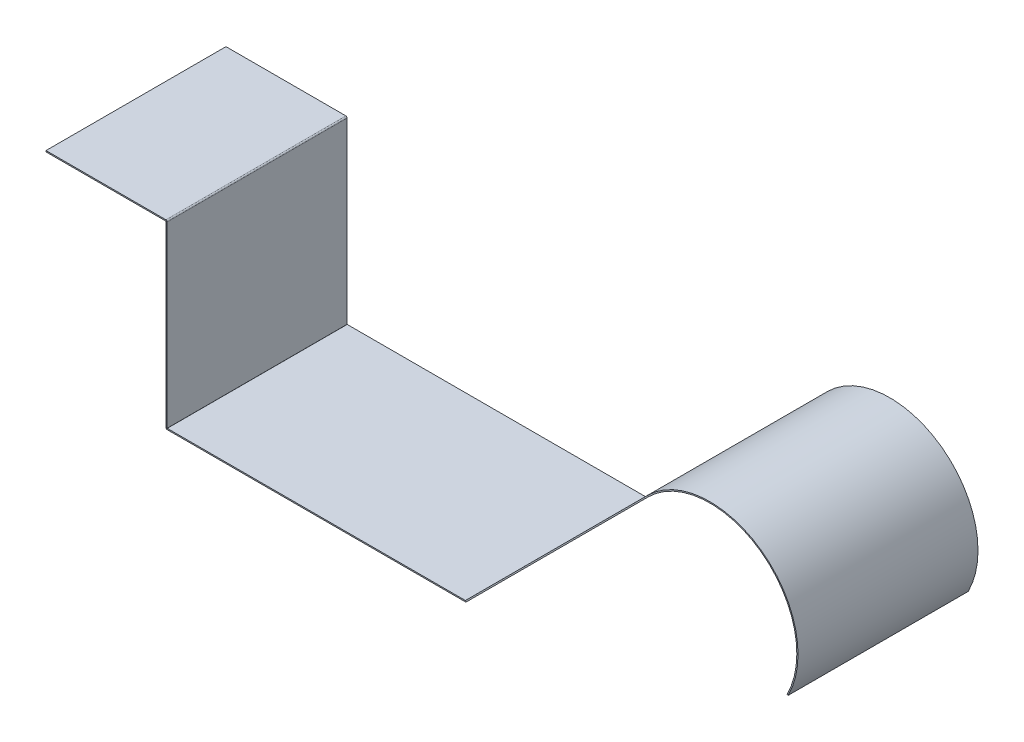
ISO-10303-21;
HEADER;
FILE_DESCRIPTION(('STEP AP214'),'2;1');
FILE_NAME('part.step','',(''),(''),'','','');
FILE_SCHEMA(('AUTOMOTIVE_DESIGN { 1 0 10303 214 1 1 1 1 }'));
ENDSEC;
DATA;
#1=APPLICATION_CONTEXT('core data for automotive mechanical design processes');
#2=APPLICATION_PROTOCOL_DEFINITION('international standard','automotive_design',2000,#1);
#3=PRODUCT_CONTEXT('',#1,'mechanical');
#4=PRODUCT('Part','Part','',(#3));
#5=PRODUCT_RELATED_PRODUCT_CATEGORY('part','',(#4));
#6=PRODUCT_DEFINITION_FORMATION('','',#4);
#7=PRODUCT_DEFINITION_CONTEXT('part definition',#1,'design');
#8=PRODUCT_DEFINITION('design','',#6,#7);
#9=PRODUCT_DEFINITION_SHAPE('','',#8);
#10=(LENGTH_UNIT() NAMED_UNIT(*) SI_UNIT(.MILLI.,.METRE.));
#11=(NAMED_UNIT(*) PLANE_ANGLE_UNIT() SI_UNIT($,.RADIAN.));
#12=(NAMED_UNIT(*) SI_UNIT($,.STERADIAN.) SOLID_ANGLE_UNIT());
#13=UNCERTAINTY_MEASURE_WITH_UNIT(LENGTH_MEASURE(1.E-05),#10,'distance_accuracy_value','');
#14=(GEOMETRIC_REPRESENTATION_CONTEXT(3) GLOBAL_UNCERTAINTY_ASSIGNED_CONTEXT((#13)) GLOBAL_UNIT_ASSIGNED_CONTEXT((#10,
#11,#12)) REPRESENTATION_CONTEXT('',''));
#15=CARTESIAN_POINT('',(0.,0.,0.));
#16=DIRECTION('',(0.,0.,1.));
#17=DIRECTION('',(1.,0.,0.));
#18=AXIS2_PLACEMENT_3D('',#15,#16,#17);
#19=CARTESIAN_POINT('',(802.641702347842,305.470129472589,-300.));
#20=DIRECTION('',(0.,0.,-1.));
#21=DIRECTION('',(-1.,0.,0.));
#22=AXIS2_PLACEMENT_3D('',#19,#20,#21);
#23=PLANE('',#22);
#24=DIRECTION('',(0.707106781186561,-0.707106781186534,0.));
#25=VECTOR('',#24,1.);
#26=CARTESIAN_POINT('',(802.641702347842,305.470129472589,-300.));
#27=LINE('',#26,#25);
#28=CARTESIAN_POINT('',(802.641702347842,305.470129472589,-300.));
#29=VERTEX_POINT('',#28);
#30=CARTESIAN_POINT('',(804.055915910215,304.055915910216,-300.));
#31=VERTEX_POINT('',#30);
#32=EDGE_CURVE('E11',#29,#31,#27,.T.);
#33=ORIENTED_EDGE('',*,*,#32,.F.);
#34=CARTESIAN_POINT('',(906.586399182264,201.525432638167,-300.));
#35=DIRECTION('',(0.,0.,1.));
#36=DIRECTION('',(1.,0.,0.));
#37=AXIS2_PLACEMENT_3D('',#34,#35,#36);
#38=CIRCLE('',#37,147.);
#39=CARTESIAN_POINT('',(1037.18815341574,134.055574248377,-300.));
#40=VERTEX_POINT('',#39);
#41=EDGE_CURVE('E394',#29,#40,#38,.F.);
#42=ORIENTED_EDGE('',*,*,#41,.T.);
#43=DIRECTION('',(-0.888447307710709,0.458978628502016,0.));
#44=VECTOR('',#43,1.);
#45=CARTESIAN_POINT('',(1037.18815341574,134.055574248377,-300.));
#46=LINE('',#45,#44);
#47=CARTESIAN_POINT('',(1035.41125880032,134.973531505381,-300.));
#48=VERTEX_POINT('',#47);
#49=EDGE_CURVE('E130',#40,#48,#46,.T.);
#50=ORIENTED_EDGE('',*,*,#49,.T.);
#51=CARTESIAN_POINT('',(906.586399182264,201.525432638167,-300.));
#52=DIRECTION('',(0.,0.,-1.));
#53=DIRECTION('',(-1.,0.,0.));
#54=AXIS2_PLACEMENT_3D('',#51,#52,#53);
#55=CIRCLE('',#54,145.);
#56=EDGE_CURVE('E292',#31,#48,#55,.T.);
#57=ORIENTED_EDGE('',*,*,#56,.F.);
#58=EDGE_LOOP('',(#33,#42,#50,#57));
#59=FACE_BOUND('',#58,.T.);
#60=ADVANCED_FACE('F41',(#59),#23,.T.);
#61=CARTESIAN_POINT('',(804.055915910215,304.055915910216,0.));
#62=DIRECTION('',(0.,0.,1.));
#63=DIRECTION('',(1.,0.,0.));
#64=AXIS2_PLACEMENT_3D('',#61,#62,#63);
#65=PLANE('',#64);
#66=DIRECTION('',(-0.707106781186561,0.707106781186534,0.));
#67=VECTOR('',#66,1.);
#68=CARTESIAN_POINT('',(804.055915910215,304.055915910216,0.));
#69=LINE('',#68,#67);
#70=CARTESIAN_POINT('',(804.055915910215,304.055915910216,0.));
#71=VERTEX_POINT('',#70);
#72=CARTESIAN_POINT('',(802.641702347842,305.470129472589,0.));
#73=VERTEX_POINT('',#72);
#74=EDGE_CURVE('E50',#71,#73,#69,.T.);
#75=ORIENTED_EDGE('',*,*,#74,.F.);
#76=CARTESIAN_POINT('',(906.586399182264,201.525432638167,0.));
#77=DIRECTION('',(0.,0.,-1.));
#78=DIRECTION('',(-1.,0.,0.));
#79=AXIS2_PLACEMENT_3D('',#76,#77,#78);
#80=CIRCLE('',#79,145.);
#81=CARTESIAN_POINT('',(1035.41125880032,134.973531505381,0.));
#82=VERTEX_POINT('',#81);
#83=EDGE_CURVE('E227',#71,#82,#80,.T.);
#84=ORIENTED_EDGE('',*,*,#83,.T.);
#85=DIRECTION('',(-0.888447307710709,0.458978628502016,0.));
#86=VECTOR('',#85,1.);
#87=CARTESIAN_POINT('',(1037.18815341574,134.055574248377,0.));
#88=LINE('',#87,#86);
#89=CARTESIAN_POINT('',(1037.18815341574,134.055574248377,0.));
#90=VERTEX_POINT('',#89);
#91=EDGE_CURVE('E230',#90,#82,#88,.T.);
#92=ORIENTED_EDGE('',*,*,#91,.F.);
#93=CARTESIAN_POINT('',(906.586399182264,201.525432638167,0.));
#94=DIRECTION('',(0.,0.,1.));
#95=DIRECTION('',(1.,0.,0.));
#96=AXIS2_PLACEMENT_3D('',#93,#94,#95);
#97=CIRCLE('',#96,147.);
#98=EDGE_CURVE('E234',#73,#90,#97,.F.);
#99=ORIENTED_EDGE('',*,*,#98,.F.);
#100=EDGE_LOOP('',(#75,#84,#92,#99));
#101=FACE_BOUND('',#100,.T.);
#102=ADVANCED_FACE('F396',(#101),#65,.T.);
#103=CARTESIAN_POINT('',(0.,299.9,-300.));
#104=DIRECTION('',(0.,0.,-1.));
#105=DIRECTION('',(-1.,0.,0.));
#106=AXIS2_PLACEMENT_3D('',#103,#104,#105);
#107=PLANE('',#106);
#108=DIRECTION('',(1.,0.,0.));
#109=VECTOR('',#108,1.);
#110=CARTESIAN_POINT('',(0.,299.9,-300.));
#111=LINE('',#110,#109);
#112=CARTESIAN_POINT('',(0.,299.9,-300.));
#113=VERTEX_POINT('',#112);
#114=CARTESIAN_POINT('',(2.,299.9,-300.));
#115=VERTEX_POINT('',#114);
#116=EDGE_CURVE('E380',#113,#115,#111,.T.);
#117=ORIENTED_EDGE('',*,*,#116,.F.);
#118=CARTESIAN_POINT('',(-0.0999999999999957,299.9,-300.));
#119=DIRECTION('',(0.,0.,1.));
#120=DIRECTION('',(1.,0.,0.));
#121=AXIS2_PLACEMENT_3D('',#118,#119,#120);
#122=CIRCLE('',#121,0.1);
#123=CARTESIAN_POINT('',(-0.099999999999989,300.,-300.));
#124=VERTEX_POINT('',#123);
#125=EDGE_CURVE('E439',#124,#113,#122,.F.);
#126=ORIENTED_EDGE('',*,*,#125,.F.);
#127=DIRECTION('',(0.,-1.,0.));
#128=VECTOR('',#127,1.);
#129=CARTESIAN_POINT('',(-0.0999999999998539,302.,-300.));
#130=LINE('',#129,#128);
#131=CARTESIAN_POINT('',(-0.0999999999998539,302.,-300.));
#132=VERTEX_POINT('',#131);
#133=EDGE_CURVE('E377',#132,#124,#130,.T.);
#134=ORIENTED_EDGE('',*,*,#133,.F.);
#135=CARTESIAN_POINT('',(-0.0999999999999957,299.9,-300.));
#136=DIRECTION('',(0.,0.,1.));
#137=DIRECTION('',(1.,0.,0.));
#138=AXIS2_PLACEMENT_3D('',#135,#136,#137);
#139=CIRCLE('',#138,2.1);
#140=EDGE_CURVE('E424',#132,#115,#139,.F.);
#141=ORIENTED_EDGE('',*,*,#140,.T.);
#142=EDGE_LOOP('',(#117,#126,#134,#141));
#143=FACE_BOUND('',#142,.T.);
#144=ADVANCED_FACE('F459',(#143),#107,.T.);
#145=CARTESIAN_POINT('',(-0.0999999999998539,302.,-300.));
#146=DIRECTION('',(0.,0.,-1.));
#147=DIRECTION('',(-1.,0.,0.));
#148=AXIS2_PLACEMENT_3D('',#145,#146,#147);
#149=PLANE('',#148);
#150=DIRECTION('',(0.,-1.,0.));
#151=VECTOR('',#150,1.);
#152=CARTESIAN_POINT('',(0.,300.,-300.));
#153=LINE('',#152,#151);
#154=CARTESIAN_POINT('',(0.,2.09999999999999,-300.));
#155=VERTEX_POINT('',#154);
#156=EDGE_CURVE('E219',#113,#155,#153,.T.);
#157=ORIENTED_EDGE('',*,*,#156,.F.);
#158=ORIENTED_EDGE('',*,*,#116,.T.);
#159=DIRECTION('',(0.,-1.,0.));
#160=VECTOR('',#159,1.);
#161=CARTESIAN_POINT('',(2.,300.,-300.));
#162=LINE('',#161,#160);
#163=CARTESIAN_POINT('',(2.,2.1,-300.));
#164=VERTEX_POINT('',#163);
#165=EDGE_CURVE('E420',#115,#164,#162,.T.);
#166=ORIENTED_EDGE('',*,*,#165,.T.);
#167=DIRECTION('',(-1.,0.,0.));
#168=VECTOR('',#167,1.);
#169=CARTESIAN_POINT('',(2.,2.1,-300.));
#170=LINE('',#169,#168);
#171=EDGE_CURVE('E365',#164,#155,#170,.T.);
#172=ORIENTED_EDGE('',*,*,#171,.T.);
#173=EDGE_LOOP('',(#157,#158,#166,#172));
#174=FACE_BOUND('',#173,.T.);
#175=ADVANCED_FACE('F452',(#174),#149,.T.);
#176=CARTESIAN_POINT('',(-0.099999999999989,300.,0.));
#177=DIRECTION('',(0.,0.,1.));
#178=DIRECTION('',(1.,0.,0.));
#179=AXIS2_PLACEMENT_3D('',#176,#177,#178);
#180=PLANE('',#179);
#181=DIRECTION('',(0.,1.,0.));
#182=VECTOR('',#181,1.);
#183=CARTESIAN_POINT('',(-0.099999999999989,300.,0.));
#184=LINE('',#183,#182);
#185=CARTESIAN_POINT('',(-0.099999999999989,300.,0.));
#186=VERTEX_POINT('',#185);
#187=CARTESIAN_POINT('',(-0.0999999999998539,302.,0.));
#188=VERTEX_POINT('',#187);
#189=EDGE_CURVE('E374',#186,#188,#184,.T.);
#190=ORIENTED_EDGE('',*,*,#189,.F.);
#191=CARTESIAN_POINT('',(-0.0999999999999957,299.9,0.));
#192=DIRECTION('',(0.,0.,1.));
#193=DIRECTION('',(1.,0.,0.));
#194=AXIS2_PLACEMENT_3D('',#191,#192,#193);
#195=CIRCLE('',#194,0.1);
#196=CARTESIAN_POINT('',(0.,299.9,0.));
#197=VERTEX_POINT('',#196);
#198=EDGE_CURVE('E272',#186,#197,#195,.F.);
#199=ORIENTED_EDGE('',*,*,#198,.T.);
#200=DIRECTION('',(-1.,0.,0.));
#201=VECTOR('',#200,1.);
#202=CARTESIAN_POINT('',(2.,299.9,0.));
#203=LINE('',#202,#201);
#204=CARTESIAN_POINT('',(2.,299.9,0.));
#205=VERTEX_POINT('',#204);
#206=EDGE_CURVE('E371',#205,#197,#203,.T.);
#207=ORIENTED_EDGE('',*,*,#206,.F.);
#208=CARTESIAN_POINT('',(-0.0999999999999957,299.9,0.));
#209=DIRECTION('',(0.,0.,1.));
#210=DIRECTION('',(1.,0.,0.));
#211=AXIS2_PLACEMENT_3D('',#208,#209,#210);
#212=CIRCLE('',#211,2.1);
#213=EDGE_CURVE('E257',#188,#205,#212,.F.);
#214=ORIENTED_EDGE('',*,*,#213,.F.);
#215=EDGE_LOOP('',(#190,#199,#207,#214));
#216=FACE_BOUND('',#215,.T.);
#217=ADVANCED_FACE('F497',(#216),#180,.T.);
#218=CARTESIAN_POINT('',(2.,299.9,0.));
#219=DIRECTION('',(0.,0.,1.));
#220=DIRECTION('',(1.,0.,0.));
#221=AXIS2_PLACEMENT_3D('',#218,#219,#220);
#222=PLANE('',#221);
#223=DIRECTION('',(1.,0.,0.));
#224=VECTOR('',#223,1.);
#225=CARTESIAN_POINT('',(-200.,300.,0.));
#226=LINE('',#225,#224);
#227=CARTESIAN_POINT('',(-200.,300.,0.));
#228=VERTEX_POINT('',#227);
#229=EDGE_CURVE('E268',#228,#186,#226,.T.);
#230=ORIENTED_EDGE('',*,*,#229,.T.);
#231=ORIENTED_EDGE('',*,*,#189,.T.);
#232=DIRECTION('',(1.,0.,0.));
#233=VECTOR('',#232,1.);
#234=CARTESIAN_POINT('',(-200.,302.,0.));
#235=LINE('',#234,#233);
#236=CARTESIAN_POINT('',(-200.,302.,0.));
#237=VERTEX_POINT('',#236);
#238=EDGE_CURVE('E261',#237,#188,#235,.T.);
#239=ORIENTED_EDGE('',*,*,#238,.F.);
#240=DIRECTION('',(0.,1.,0.));
#241=VECTOR('',#240,1.);
#242=CARTESIAN_POINT('',(-200.,300.,0.));
#243=LINE('',#242,#241);
#244=EDGE_CURVE('E265',#228,#237,#243,.T.);
#245=ORIENTED_EDGE('',*,*,#244,.F.);
#246=EDGE_LOOP('',(#230,#231,#239,#245));
#247=FACE_BOUND('',#246,.T.);
#248=ADVANCED_FACE('F500',(#247),#222,.T.);
#249=CARTESIAN_POINT('',(2.1,0.,-300.));
#250=DIRECTION('',(0.,0.,-1.));
#251=DIRECTION('',(-1.,0.,0.));
#252=AXIS2_PLACEMENT_3D('',#249,#250,#251);
#253=PLANE('',#252);
#254=DIRECTION('',(0.,1.,0.));
#255=VECTOR('',#254,1.);
#256=CARTESIAN_POINT('',(2.1,0.,-300.));
#257=LINE('',#256,#255);
#258=CARTESIAN_POINT('',(2.1,0.,-300.));
#259=VERTEX_POINT('',#258);
#260=CARTESIAN_POINT('',(2.1,2.,-300.));
#261=VERTEX_POINT('',#260);
#262=EDGE_CURVE('E368',#259,#261,#257,.T.);
#263=ORIENTED_EDGE('',*,*,#262,.F.);
#264=CARTESIAN_POINT('',(2.1,2.1,-300.));
#265=DIRECTION('',(0.,0.,-1.));
#266=DIRECTION('',(-1.,0.,0.));
#267=AXIS2_PLACEMENT_3D('',#264,#265,#266);
#268=CIRCLE('',#267,2.1);
#269=EDGE_CURVE('E216',#155,#259,#268,.F.);
#270=ORIENTED_EDGE('',*,*,#269,.F.);
#271=ORIENTED_EDGE('',*,*,#171,.F.);
#272=CARTESIAN_POINT('',(2.1,2.1,-300.));
#273=DIRECTION('',(0.,0.,1.));
#274=DIRECTION('',(1.,0.,0.));
#275=AXIS2_PLACEMENT_3D('',#272,#273,#274);
#276=CIRCLE('',#275,0.0999999999999998);
#277=EDGE_CURVE('E416',#164,#261,#276,.T.);
#278=ORIENTED_EDGE('',*,*,#277,.T.);
#279=EDGE_LOOP('',(#263,#270,#271,#278));
#280=FACE_BOUND('',#279,.T.);
#281=ADVANCED_FACE('F489',(#280),#253,.T.);
#282=CARTESIAN_POINT('',(2.,2.1,-300.));
#283=DIRECTION('',(0.,0.,-1.));
#284=DIRECTION('',(-1.,0.,0.));
#285=AXIS2_PLACEMENT_3D('',#282,#283,#284);
#286=PLANE('',#285);
#287=DIRECTION('',(1.,0.,0.));
#288=VECTOR('',#287,1.);
#289=CARTESIAN_POINT('',(0.,0.,-300.));
#290=LINE('',#289,#288);
#291=CARTESIAN_POINT('',(499.130151519017,0.,-300.));
#292=VERTEX_POINT('',#291);
#293=EDGE_CURVE('E179',#259,#292,#290,.T.);
#294=ORIENTED_EDGE('',*,*,#293,.F.);
#295=ORIENTED_EDGE('',*,*,#262,.T.);
#296=DIRECTION('',(1.,0.,0.));
#297=VECTOR('',#296,1.);
#298=CARTESIAN_POINT('',(0.,2.,-300.));
#299=LINE('',#298,#297);
#300=CARTESIAN_POINT('',(499.130151519017,1.99999999999999,-300.));
#301=VERTEX_POINT('',#300);
#302=EDGE_CURVE('E182',#261,#301,#299,.T.);
#303=ORIENTED_EDGE('',*,*,#302,.T.);
#304=DIRECTION('',(0.,-1.,0.));
#305=VECTOR('',#304,1.);
#306=CARTESIAN_POINT('',(499.130151519017,1.99999999999999,-300.));
#307=LINE('',#306,#305);
#308=EDGE_CURVE('E175',#301,#292,#307,.T.);
#309=ORIENTED_EDGE('',*,*,#308,.T.);
#310=EDGE_LOOP('',(#294,#295,#303,#309));
#311=FACE_BOUND('',#310,.T.);
#312=ADVANCED_FACE('F177',(#311),#286,.T.);
#313=CARTESIAN_POINT('',(0.,2.09999999999999,0.));
#314=DIRECTION('',(0.,0.,1.));
#315=DIRECTION('',(1.,0.,0.));
#316=AXIS2_PLACEMENT_3D('',#313,#314,#315);
#317=PLANE('',#316);
#318=DIRECTION('',(1.,0.,0.));
#319=VECTOR('',#318,1.);
#320=CARTESIAN_POINT('',(0.,2.09999999999999,0.));
#321=LINE('',#320,#319);
#322=CARTESIAN_POINT('',(0.,2.09999999999999,0.));
#323=VERTEX_POINT('',#322);
#324=CARTESIAN_POINT('',(2.,2.1,0.));
#325=VERTEX_POINT('',#324);
#326=EDGE_CURVE('E362',#323,#325,#321,.T.);
#327=ORIENTED_EDGE('',*,*,#326,.F.);
#328=CARTESIAN_POINT('',(2.1,2.1,0.));
#329=DIRECTION('',(0.,0.,-1.));
#330=DIRECTION('',(-1.,0.,0.));
#331=AXIS2_PLACEMENT_3D('',#328,#329,#330);
#332=CIRCLE('',#331,2.1);
#333=CARTESIAN_POINT('',(2.1,0.,0.));
#334=VERTEX_POINT('',#333);
#335=EDGE_CURVE('E280',#323,#334,#332,.F.);
#336=ORIENTED_EDGE('',*,*,#335,.T.);
#337=DIRECTION('',(0.,-1.,0.));
#338=VECTOR('',#337,1.);
#339=CARTESIAN_POINT('',(2.1,2.,0.));
#340=LINE('',#339,#338);
#341=CARTESIAN_POINT('',(2.1,2.,0.));
#342=VERTEX_POINT('',#341);
#343=EDGE_CURVE('E359',#342,#334,#340,.T.);
#344=ORIENTED_EDGE('',*,*,#343,.F.);
#345=CARTESIAN_POINT('',(2.1,2.1,0.));
#346=DIRECTION('',(0.,0.,1.));
#347=DIRECTION('',(1.,0.,0.));
#348=AXIS2_PLACEMENT_3D('',#345,#346,#347);
#349=CIRCLE('',#348,0.0999999999999998);
#350=EDGE_CURVE('E249',#325,#342,#349,.T.);
#351=ORIENTED_EDGE('',*,*,#350,.F.);
#352=EDGE_LOOP('',(#327,#336,#344,#351));
#353=FACE_BOUND('',#352,.T.);
#354=ADVANCED_FACE('F547',(#353),#317,.T.);
#355=CARTESIAN_POINT('',(2.1,2.,0.));
#356=DIRECTION('',(0.,0.,1.));
#357=DIRECTION('',(1.,0.,0.));
#358=AXIS2_PLACEMENT_3D('',#355,#356,#357);
#359=PLANE('',#358);
#360=DIRECTION('',(0.,-1.,0.));
#361=VECTOR('',#360,1.);
#362=CARTESIAN_POINT('',(0.,300.,0.));
#363=LINE('',#362,#361);
#364=EDGE_CURVE('E276',#197,#323,#363,.T.);
#365=ORIENTED_EDGE('',*,*,#364,.T.);
#366=ORIENTED_EDGE('',*,*,#326,.T.);
#367=DIRECTION('',(0.,-1.,0.));
#368=VECTOR('',#367,1.);
#369=CARTESIAN_POINT('',(2.,300.,0.));
#370=LINE('',#369,#368);
#371=EDGE_CURVE('E253',#205,#325,#370,.T.);
#372=ORIENTED_EDGE('',*,*,#371,.F.);
#373=ORIENTED_EDGE('',*,*,#206,.T.);
#374=EDGE_LOOP('',(#365,#366,#372,#373));
#375=FACE_BOUND('',#374,.T.);
#376=ADVANCED_FACE('F495',(#375),#359,.T.);
#377=CARTESIAN_POINT('',(500.615075759508,0.615075759508258,-300.));
#378=DIRECTION('',(0.,0.,-1.));
#379=DIRECTION('',(-1.,0.,0.));
#380=AXIS2_PLACEMENT_3D('',#377,#378,#379);
#381=PLANE('',#380);
#382=DIRECTION('',(-0.707106781186547,0.707106781186548,0.));
#383=VECTOR('',#382,1.);
#384=CARTESIAN_POINT('',(500.615075759508,0.615075759508258,-300.));
#385=LINE('',#384,#383);
#386=CARTESIAN_POINT('',(500.615075759508,0.615075759508258,-300.));
#387=VERTEX_POINT('',#386);
#388=CARTESIAN_POINT('',(499.200862197135,2.02928932188135,-300.));
#389=VERTEX_POINT('',#388);
#390=EDGE_CURVE('E188',#387,#389,#385,.T.);
#391=ORIENTED_EDGE('',*,*,#390,.F.);
#392=CARTESIAN_POINT('',(499.130151519017,2.09999999999999,-300.));
#393=DIRECTION('',(0.,0.,-1.));
#394=DIRECTION('',(-1.,0.,0.));
#395=AXIS2_PLACEMENT_3D('',#392,#393,#394);
#396=CIRCLE('',#395,2.1);
#397=EDGE_CURVE('E197',#292,#387,#396,.F.);
#398=ORIENTED_EDGE('',*,*,#397,.F.);
#399=ORIENTED_EDGE('',*,*,#308,.F.);
#400=CARTESIAN_POINT('',(499.130151519017,2.09999999999999,-300.));
#401=DIRECTION('',(0.,0.,1.));
#402=DIRECTION('',(1.,0.,0.));
#403=AXIS2_PLACEMENT_3D('',#400,#401,#402);
#404=CIRCLE('',#403,0.0999999999999998);
#405=EDGE_CURVE('E411',#301,#389,#404,.T.);
#406=ORIENTED_EDGE('',*,*,#405,.T.);
#407=EDGE_LOOP('',(#391,#398,#399,#406));
#408=FACE_BOUND('',#407,.T.);
#409=ADVANCED_FACE('F207',(#408),#381,.T.);
#410=CARTESIAN_POINT('',(499.130151519017,1.99999999999999,-300.));
#411=DIRECTION('',(0.,0.,-1.));
#412=DIRECTION('',(-1.,0.,0.));
#413=AXIS2_PLACEMENT_3D('',#410,#411,#412);
#414=PLANE('',#413);
#415=DIRECTION('',(0.707106781186546,0.707106781186549,0.));
#416=VECTOR('',#415,1.);
#417=CARTESIAN_POINT('',(500.,0.,-300.));
#418=LINE('',#417,#416);
#419=EDGE_CURVE('E210',#387,#31,#418,.T.);
#420=ORIENTED_EDGE('',*,*,#419,.F.);
#421=ORIENTED_EDGE('',*,*,#390,.T.);
#422=DIRECTION('',(0.707106781186546,0.707106781186549,0.));
#423=VECTOR('',#422,1.);
#424=CARTESIAN_POINT('',(498.585786437627,1.41421356237309,-300.));
#425=LINE('',#424,#423);
#426=EDGE_CURVE('E405',#389,#29,#425,.T.);
#427=ORIENTED_EDGE('',*,*,#426,.T.);
#428=ORIENTED_EDGE('',*,*,#32,.T.);
#429=EDGE_LOOP('',(#420,#421,#427,#428));
#430=FACE_BOUND('',#429,.T.);
#431=ADVANCED_FACE('F515',(#430),#414,.T.);
#432=CARTESIAN_POINT('',(499.130151519017,0.,0.));
#433=DIRECTION('',(0.,0.,1.));
#434=DIRECTION('',(1.,0.,0.));
#435=AXIS2_PLACEMENT_3D('',#432,#433,#434);
#436=PLANE('',#435);
#437=DIRECTION('',(0.,1.,0.));
#438=VECTOR('',#437,1.);
#439=CARTESIAN_POINT('',(499.130151519017,0.,0.));
#440=LINE('',#439,#438);
#441=CARTESIAN_POINT('',(499.130151519017,0.,0.));
#442=VERTEX_POINT('',#441);
#443=CARTESIAN_POINT('',(499.130151519017,1.99999999999999,0.));
#444=VERTEX_POINT('',#443);
#445=EDGE_CURVE('E189',#442,#444,#440,.T.);
#446=ORIENTED_EDGE('',*,*,#445,.F.);
#447=CARTESIAN_POINT('',(499.130151519017,2.09999999999999,0.));
#448=DIRECTION('',(0.,0.,-1.));
#449=DIRECTION('',(-1.,0.,0.));
#450=AXIS2_PLACEMENT_3D('',#447,#448,#449);
#451=CIRCLE('',#450,2.1);
#452=CARTESIAN_POINT('',(500.615075759508,0.615075759508258,0.));
#453=VERTEX_POINT('',#452);
#454=EDGE_CURVE('E199',#442,#453,#451,.F.);
#455=ORIENTED_EDGE('',*,*,#454,.T.);
#456=DIRECTION('',(0.707106781186547,-0.707106781186548,0.));
#457=VECTOR('',#456,1.);
#458=CARTESIAN_POINT('',(499.200862197135,2.02928932188135,0.));
#459=LINE('',#458,#457);
#460=CARTESIAN_POINT('',(499.200862197135,2.02928932188135,0.));
#461=VERTEX_POINT('',#460);
#462=EDGE_CURVE('E115',#461,#453,#459,.T.);
#463=ORIENTED_EDGE('',*,*,#462,.F.);
#464=CARTESIAN_POINT('',(499.130151519017,2.09999999999999,0.));
#465=DIRECTION('',(0.,0.,1.));
#466=DIRECTION('',(1.,0.,0.));
#467=AXIS2_PLACEMENT_3D('',#464,#465,#466);
#468=CIRCLE('',#467,0.0999999999999998);
#469=EDGE_CURVE('E241',#444,#461,#468,.T.);
#470=ORIENTED_EDGE('',*,*,#469,.F.);
#471=EDGE_LOOP('',(#446,#455,#463,#470));
#472=FACE_BOUND('',#471,.T.);
#473=ADVANCED_FACE('F521',(#472),#436,.T.);
#474=CARTESIAN_POINT('',(499.200862197135,2.02928932188135,0.));
#475=DIRECTION('',(0.,0.,1.));
#476=DIRECTION('',(1.,0.,0.));
#477=AXIS2_PLACEMENT_3D('',#474,#475,#476);
#478=PLANE('',#477);
#479=DIRECTION('',(1.,0.,0.));
#480=VECTOR('',#479,1.);
#481=CARTESIAN_POINT('',(0.,0.,0.));
#482=LINE('',#481,#480);
#483=EDGE_CURVE('E284',#334,#442,#482,.T.);
#484=ORIENTED_EDGE('',*,*,#483,.T.);
#485=ORIENTED_EDGE('',*,*,#445,.T.);
#486=DIRECTION('',(1.,0.,0.));
#487=VECTOR('',#486,1.);
#488=CARTESIAN_POINT('',(0.,2.,0.));
#489=LINE('',#488,#487);
#490=EDGE_CURVE('E245',#342,#444,#489,.T.);
#491=ORIENTED_EDGE('',*,*,#490,.F.);
#492=ORIENTED_EDGE('',*,*,#343,.T.);
#493=EDGE_LOOP('',(#484,#485,#491,#492));
#494=FACE_BOUND('',#493,.T.);
#495=ADVANCED_FACE('F527',(#494),#478,.T.);
#496=CARTESIAN_POINT('',(906.586399182264,201.525432638167,-300.));
#497=DIRECTION('',(0.,0.,1.));
#498=DIRECTION('',(1.,0.,0.));
#499=AXIS2_PLACEMENT_3D('',#496,#497,#498);
#500=CYLINDRICAL_SURFACE('',#499,145.);
#501=ORIENTED_EDGE('',*,*,#83,.F.);
#502=DIRECTION('',(0.,0.,1.));
#503=VECTOR('',#502,1.);
#504=CARTESIAN_POINT('',(804.055915910215,304.055915910216,-300.));
#505=LINE('',#504,#503);
#506=EDGE_CURVE('E293',#31,#71,#505,.T.);
#507=ORIENTED_EDGE('',*,*,#506,.F.);
#508=ORIENTED_EDGE('',*,*,#56,.T.);
#509=DIRECTION('',(0.,0.,1.));
#510=VECTOR('',#509,1.);
#511=CARTESIAN_POINT('',(1035.41125880032,134.973531505381,-300.));
#512=LINE('',#511,#510);
#513=EDGE_CURVE('E226',#48,#82,#512,.T.);
#514=ORIENTED_EDGE('',*,*,#513,.T.);
#515=EDGE_LOOP('',(#501,#507,#508,#514));
#516=FACE_BOUND('',#515,.T.);
#517=ADVANCED_FACE('F525',(#516),#500,.F.);
#518=CARTESIAN_POINT('',(500.,0.,-300.));
#519=DIRECTION('',(0.707106781186549,-0.707106781186546,0.));
#520=DIRECTION('',(0.707106781186546,0.707106781186549,0.));
#521=AXIS2_PLACEMENT_3D('',#518,#519,#520);
#522=PLANE('',#521);
#523=DIRECTION('',(0.707106781186546,0.707106781186549,0.));
#524=VECTOR('',#523,1.);
#525=CARTESIAN_POINT('',(500.,0.,0.));
#526=LINE('',#525,#524);
#527=EDGE_CURVE('E289',#453,#71,#526,.T.);
#528=ORIENTED_EDGE('',*,*,#527,.F.);
#529=DIRECTION('',(0.,0.,1.));
#530=VECTOR('',#529,1.);
#531=CARTESIAN_POINT('',(500.615075759508,0.615075759508258,-300.));
#532=LINE('',#531,#530);
#533=EDGE_CURVE('E204',#387,#453,#532,.T.);
#534=ORIENTED_EDGE('',*,*,#533,.F.);
#535=ORIENTED_EDGE('',*,*,#419,.T.);
#536=ORIENTED_EDGE('',*,*,#506,.T.);
#537=EDGE_LOOP('',(#528,#534,#535,#536));
#538=FACE_BOUND('',#537,.T.);
#539=ADVANCED_FACE('F523',(#538),#522,.T.);
#540=CARTESIAN_POINT('',(499.130151519017,2.09999999999999,-300.));
#541=DIRECTION('',(0.,0.,1.));
#542=DIRECTION('',(1.,0.,0.));
#543=AXIS2_PLACEMENT_3D('',#540,#541,#542);
#544=CYLINDRICAL_SURFACE('',#543,2.1);
#545=ORIENTED_EDGE('',*,*,#454,.F.);
#546=DIRECTION('',(0.,0.,1.));
#547=VECTOR('',#546,1.);
#548=CARTESIAN_POINT('',(499.130151519017,0.,-300.));
#549=LINE('',#548,#547);
#550=EDGE_CURVE('E195',#292,#442,#549,.T.);
#551=ORIENTED_EDGE('',*,*,#550,.F.);
#552=ORIENTED_EDGE('',*,*,#397,.T.);
#553=ORIENTED_EDGE('',*,*,#533,.T.);
#554=EDGE_LOOP('',(#545,#551,#552,#553));
#555=FACE_BOUND('',#554,.T.);
#556=ADVANCED_FACE('F196',(#555),#544,.T.);
#557=CARTESIAN_POINT('',(0.,0.,-300.));
#558=DIRECTION('',(0.,-1.,0.));
#559=DIRECTION('',(0.,0.,-1.));
#560=AXIS2_PLACEMENT_3D('',#557,#558,#559);
#561=PLANE('',#560);
#562=ORIENTED_EDGE('',*,*,#483,.F.);
#563=DIRECTION('',(0.,0.,1.));
#564=VECTOR('',#563,1.);
#565=CARTESIAN_POINT('',(2.1,0.,-300.));
#566=LINE('',#565,#564);
#567=EDGE_CURVE('E205',#259,#334,#566,.T.);
#568=ORIENTED_EDGE('',*,*,#567,.F.);
#569=ORIENTED_EDGE('',*,*,#293,.T.);
#570=ORIENTED_EDGE('',*,*,#550,.T.);
#571=EDGE_LOOP('',(#562,#568,#569,#570));
#572=FACE_BOUND('',#571,.T.);
#573=ADVANCED_FACE('F213',(#572),#561,.T.);
#574=CARTESIAN_POINT('',(2.1,2.1,-300.));
#575=DIRECTION('',(0.,0.,1.));
#576=DIRECTION('',(1.,0.,0.));
#577=AXIS2_PLACEMENT_3D('',#574,#575,#576);
#578=CYLINDRICAL_SURFACE('',#577,2.1);
#579=ORIENTED_EDGE('',*,*,#335,.F.);
#580=DIRECTION('',(0.,0.,1.));
#581=VECTOR('',#580,1.);
#582=CARTESIAN_POINT('',(0.,2.09999999999999,-300.));
#583=LINE('',#582,#581);
#584=EDGE_CURVE('E300',#155,#323,#583,.T.);
#585=ORIENTED_EDGE('',*,*,#584,.F.);
#586=ORIENTED_EDGE('',*,*,#269,.T.);
#587=ORIENTED_EDGE('',*,*,#567,.T.);
#588=EDGE_LOOP('',(#579,#585,#586,#587));
#589=FACE_BOUND('',#588,.T.);
#590=ADVANCED_FACE('F492',(#589),#578,.T.);
#591=CARTESIAN_POINT('',(0.,300.,-300.));
#592=DIRECTION('',(-1.,0.,0.));
#593=DIRECTION('',(0.,-1.,0.));
#594=AXIS2_PLACEMENT_3D('',#591,#592,#593);
#595=PLANE('',#594);
#596=ORIENTED_EDGE('',*,*,#364,.F.);
#597=DIRECTION('',(0.,0.,1.));
#598=VECTOR('',#597,1.);
#599=CARTESIAN_POINT('',(0.,299.9,-300.));
#600=LINE('',#599,#598);
#601=EDGE_CURVE('E304',#113,#197,#600,.T.);
#602=ORIENTED_EDGE('',*,*,#601,.F.);
#603=ORIENTED_EDGE('',*,*,#156,.T.);
#604=ORIENTED_EDGE('',*,*,#584,.T.);
#605=EDGE_LOOP('',(#596,#602,#603,#604));
#606=FACE_BOUND('',#605,.T.);
#607=ADVANCED_FACE('F448',(#606),#595,.T.);
#608=CARTESIAN_POINT('',(-0.0999999999999957,299.9,-300.));
#609=DIRECTION('',(0.,0.,1.));
#610=DIRECTION('',(1.,0.,0.));
#611=AXIS2_PLACEMENT_3D('',#608,#609,#610);
#612=CYLINDRICAL_SURFACE('',#611,0.1);
#613=ORIENTED_EDGE('',*,*,#198,.F.);
#614=DIRECTION('',(0.,0.,1.));
#615=VECTOR('',#614,1.);
#616=CARTESIAN_POINT('',(-0.099999999999989,300.,-300.));
#617=LINE('',#616,#615);
#618=EDGE_CURVE('E308',#124,#186,#617,.T.);
#619=ORIENTED_EDGE('',*,*,#618,.F.);
#620=ORIENTED_EDGE('',*,*,#125,.T.);
#621=ORIENTED_EDGE('',*,*,#601,.T.);
#622=EDGE_LOOP('',(#613,#619,#620,#621));
#623=FACE_BOUND('',#622,.T.);
#624=ADVANCED_FACE('F457',(#623),#612,.F.);
#625=CARTESIAN_POINT('',(-200.,300.,-300.));
#626=DIRECTION('',(0.,-1.,0.));
#627=DIRECTION('',(0.,0.,-1.));
#628=AXIS2_PLACEMENT_3D('',#625,#626,#627);
#629=PLANE('',#628);
#630=ORIENTED_EDGE('',*,*,#229,.F.);
#631=DIRECTION('',(0.,0.,1.));
#632=VECTOR('',#631,1.);
#633=CARTESIAN_POINT('',(-200.,300.,-300.));
#634=LINE('',#633,#632);
#635=CARTESIAN_POINT('',(-200.,300.,-300.));
#636=VERTEX_POINT('',#635);
#637=EDGE_CURVE('E312',#636,#228,#634,.T.);
#638=ORIENTED_EDGE('',*,*,#637,.F.);
#639=DIRECTION('',(1.,0.,0.));
#640=VECTOR('',#639,1.);
#641=CARTESIAN_POINT('',(-200.,300.,-300.));
#642=LINE('',#641,#640);
#643=EDGE_CURVE('E435',#636,#124,#642,.T.);
#644=ORIENTED_EDGE('',*,*,#643,.T.);
#645=ORIENTED_EDGE('',*,*,#618,.T.);
#646=EDGE_LOOP('',(#630,#638,#644,#645));
#647=FACE_BOUND('',#646,.T.);
#648=ADVANCED_FACE('F463',(#647),#629,.T.);
#649=CARTESIAN_POINT('',(-200.,300.,-300.));
#650=DIRECTION('',(1.,0.,0.));
#651=DIRECTION('',(0.,0.,-1.));
#652=AXIS2_PLACEMENT_3D('',#649,#650,#651);
#653=PLANE('',#652);
#654=ORIENTED_EDGE('',*,*,#244,.T.);
#655=DIRECTION('',(0.,0.,1.));
#656=VECTOR('',#655,1.);
#657=CARTESIAN_POINT('',(-200.,302.,-300.));
#658=LINE('',#657,#656);
#659=CARTESIAN_POINT('',(-200.,302.,-300.));
#660=VERTEX_POINT('',#659);
#661=EDGE_CURVE('E315',#660,#237,#658,.T.);
#662=ORIENTED_EDGE('',*,*,#661,.F.);
#663=DIRECTION('',(0.,1.,0.));
#664=VECTOR('',#663,1.);
#665=CARTESIAN_POINT('',(-200.,300.,-300.));
#666=LINE('',#665,#664);
#667=EDGE_CURVE('E432',#636,#660,#666,.T.);
#668=ORIENTED_EDGE('',*,*,#667,.F.);
#669=ORIENTED_EDGE('',*,*,#637,.T.);
#670=EDGE_LOOP('',(#654,#662,#668,#669));
#671=FACE_BOUND('',#670,.T.);
#672=ADVANCED_FACE('F502',(#671),#653,.F.);
#673=CARTESIAN_POINT('',(-200.,302.,-300.));
#674=DIRECTION('',(0.,-1.,0.));
#675=DIRECTION('',(0.,0.,-1.));
#676=AXIS2_PLACEMENT_3D('',#673,#674,#675);
#677=PLANE('',#676);
#678=ORIENTED_EDGE('',*,*,#238,.T.);
#679=DIRECTION('',(0.,0.,1.));
#680=VECTOR('',#679,1.);
#681=CARTESIAN_POINT('',(-0.0999999999998539,302.,-300.));
#682=LINE('',#681,#680);
#683=EDGE_CURVE('E319',#132,#188,#682,.T.);
#684=ORIENTED_EDGE('',*,*,#683,.F.);
#685=DIRECTION('',(1.,0.,0.));
#686=VECTOR('',#685,1.);
#687=CARTESIAN_POINT('',(-200.,302.,-300.));
#688=LINE('',#687,#686);
#689=EDGE_CURVE('E428',#660,#132,#688,.T.);
#690=ORIENTED_EDGE('',*,*,#689,.F.);
#691=ORIENTED_EDGE('',*,*,#661,.T.);
#692=EDGE_LOOP('',(#678,#684,#690,#691));
#693=FACE_BOUND('',#692,.T.);
#694=ADVANCED_FACE('F472',(#693),#677,.F.);
#695=CARTESIAN_POINT('',(-0.0999999999999957,299.9,-300.));
#696=DIRECTION('',(0.,0.,1.));
#697=DIRECTION('',(1.,0.,0.));
#698=AXIS2_PLACEMENT_3D('',#695,#696,#697);
#699=CYLINDRICAL_SURFACE('',#698,2.1);
#700=ORIENTED_EDGE('',*,*,#213,.T.);
#701=DIRECTION('',(0.,0.,1.));
#702=VECTOR('',#701,1.);
#703=CARTESIAN_POINT('',(2.,299.9,-300.));
#704=LINE('',#703,#702);
#705=EDGE_CURVE('E323',#115,#205,#704,.T.);
#706=ORIENTED_EDGE('',*,*,#705,.F.);
#707=ORIENTED_EDGE('',*,*,#140,.F.);
#708=ORIENTED_EDGE('',*,*,#683,.T.);
#709=EDGE_LOOP('',(#700,#706,#707,#708));
#710=FACE_BOUND('',#709,.T.);
#711=ADVANCED_FACE('F477',(#710),#699,.T.);
#712=CARTESIAN_POINT('',(2.,300.,-300.));
#713=DIRECTION('',(-1.,0.,0.));
#714=DIRECTION('',(0.,-1.,0.));
#715=AXIS2_PLACEMENT_3D('',#712,#713,#714);
#716=PLANE('',#715);
#717=ORIENTED_EDGE('',*,*,#371,.T.);
#718=DIRECTION('',(0.,0.,1.));
#719=VECTOR('',#718,1.);
#720=CARTESIAN_POINT('',(2.,2.1,-300.));
#721=LINE('',#720,#719);
#722=EDGE_CURVE('E327',#164,#325,#721,.T.);
#723=ORIENTED_EDGE('',*,*,#722,.F.);
#724=ORIENTED_EDGE('',*,*,#165,.F.);
#725=ORIENTED_EDGE('',*,*,#705,.T.);
#726=EDGE_LOOP('',(#717,#723,#724,#725));
#727=FACE_BOUND('',#726,.T.);
#728=ADVANCED_FACE('F482',(#727),#716,.F.);
#729=CARTESIAN_POINT('',(2.1,2.1,-300.));
#730=DIRECTION('',(0.,0.,1.));
#731=DIRECTION('',(1.,0.,0.));
#732=AXIS2_PLACEMENT_3D('',#729,#730,#731);
#733=CYLINDRICAL_SURFACE('',#732,0.0999999999999998);
#734=ORIENTED_EDGE('',*,*,#350,.T.);
#735=DIRECTION('',(0.,0.,1.));
#736=VECTOR('',#735,1.);
#737=CARTESIAN_POINT('',(2.1,2.,-300.));
#738=LINE('',#737,#736);
#739=EDGE_CURVE('E331',#261,#342,#738,.T.);
#740=ORIENTED_EDGE('',*,*,#739,.F.);
#741=ORIENTED_EDGE('',*,*,#277,.F.);
#742=ORIENTED_EDGE('',*,*,#722,.T.);
#743=EDGE_LOOP('',(#734,#740,#741,#742));
#744=FACE_BOUND('',#743,.T.);
#745=ADVANCED_FACE('F487',(#744),#733,.F.);
#746=CARTESIAN_POINT('',(0.,2.,-300.));
#747=DIRECTION('',(0.,-1.,0.));
#748=DIRECTION('',(0.,0.,-1.));
#749=AXIS2_PLACEMENT_3D('',#746,#747,#748);
#750=PLANE('',#749);
#751=ORIENTED_EDGE('',*,*,#490,.T.);
#752=DIRECTION('',(0.,0.,1.));
#753=VECTOR('',#752,1.);
#754=CARTESIAN_POINT('',(499.130151519017,1.99999999999999,-300.));
#755=LINE('',#754,#753);
#756=EDGE_CURVE('E335',#301,#444,#755,.T.);
#757=ORIENTED_EDGE('',*,*,#756,.F.);
#758=ORIENTED_EDGE('',*,*,#302,.F.);
#759=ORIENTED_EDGE('',*,*,#739,.T.);
#760=EDGE_LOOP('',(#751,#757,#758,#759));
#761=FACE_BOUND('',#760,.T.);
#762=ADVANCED_FACE('F713',(#761),#750,.F.);
#763=CARTESIAN_POINT('',(499.130151519017,2.09999999999999,-300.));
#764=DIRECTION('',(0.,0.,1.));
#765=DIRECTION('',(1.,0.,0.));
#766=AXIS2_PLACEMENT_3D('',#763,#764,#765);
#767=CYLINDRICAL_SURFACE('',#766,0.0999999999999998);
#768=ORIENTED_EDGE('',*,*,#469,.T.);
#769=DIRECTION('',(0.,0.,1.));
#770=VECTOR('',#769,1.);
#771=CARTESIAN_POINT('',(499.200862197135,2.02928932188135,-300.));
#772=LINE('',#771,#770);
#773=EDGE_CURVE('E339',#389,#461,#772,.T.);
#774=ORIENTED_EDGE('',*,*,#773,.F.);
#775=ORIENTED_EDGE('',*,*,#405,.F.);
#776=ORIENTED_EDGE('',*,*,#756,.T.);
#777=EDGE_LOOP('',(#768,#774,#775,#776));
#778=FACE_BOUND('',#777,.T.);
#779=ADVANCED_FACE('F518',(#778),#767,.F.);
#780=CARTESIAN_POINT('',(498.585786437627,1.41421356237309,-300.));
#781=DIRECTION('',(0.707106781186549,-0.707106781186546,0.));
#782=DIRECTION('',(0.707106781186546,0.707106781186549,0.));
#783=AXIS2_PLACEMENT_3D('',#780,#781,#782);
#784=PLANE('',#783);
#785=DIRECTION('',(0.707106781186546,0.707106781186549,0.));
#786=VECTOR('',#785,1.);
#787=CARTESIAN_POINT('',(498.585786437627,1.41421356237309,0.));
#788=LINE('',#787,#786);
#789=EDGE_CURVE('E237',#461,#73,#788,.T.);
#790=ORIENTED_EDGE('',*,*,#789,.T.);
#791=DIRECTION('',(0.,0.,1.));
#792=VECTOR('',#791,1.);
#793=CARTESIAN_POINT('',(802.641702347842,305.470129472589,-300.));
#794=LINE('',#793,#792);
#795=EDGE_CURVE('E343',#29,#73,#794,.T.);
#796=ORIENTED_EDGE('',*,*,#795,.F.);
#797=ORIENTED_EDGE('',*,*,#426,.F.);
#798=ORIENTED_EDGE('',*,*,#773,.T.);
#799=EDGE_LOOP('',(#790,#796,#797,#798));
#800=FACE_BOUND('',#799,.T.);
#801=ADVANCED_FACE('F387',(#800),#784,.F.);
#802=CARTESIAN_POINT('',(906.586399182264,201.525432638167,-300.));
#803=DIRECTION('',(0.,0.,1.));
#804=DIRECTION('',(1.,0.,0.));
#805=AXIS2_PLACEMENT_3D('',#802,#803,#804);
#806=CYLINDRICAL_SURFACE('',#805,147.);
#807=ORIENTED_EDGE('',*,*,#98,.T.);
#808=DIRECTION('',(0.,0.,1.));
#809=VECTOR('',#808,1.);
#810=CARTESIAN_POINT('',(1037.18815341574,134.055574248377,-300.));
#811=LINE('',#810,#809);
#812=EDGE_CURVE('E347',#40,#90,#811,.T.);
#813=ORIENTED_EDGE('',*,*,#812,.F.);
#814=ORIENTED_EDGE('',*,*,#41,.F.);
#815=ORIENTED_EDGE('',*,*,#795,.T.);
#816=EDGE_LOOP('',(#807,#813,#814,#815));
#817=FACE_BOUND('',#816,.T.);
#818=ADVANCED_FACE('F392',(#817),#806,.T.);
#819=CARTESIAN_POINT('',(1037.18815341574,134.055574248377,-300.));
#820=DIRECTION('',(0.458978628502016,0.888447307710709,0.));
#821=DIRECTION('',(-0.888447307710709,0.458978628502016,0.));
#822=AXIS2_PLACEMENT_3D('',#819,#820,#821);
#823=PLANE('',#822);
#824=ORIENTED_EDGE('',*,*,#91,.T.);
#825=ORIENTED_EDGE('',*,*,#513,.F.);
#826=ORIENTED_EDGE('',*,*,#49,.F.);
#827=ORIENTED_EDGE('',*,*,#812,.T.);
#828=EDGE_LOOP('',(#824,#825,#826,#827));
#829=FACE_BOUND('',#828,.T.);
#830=ADVANCED_FACE('F399',(#829),#823,.F.);
#831=CARTESIAN_POINT('',(906.586399182264,201.525432638167,-300.));
#832=DIRECTION('',(0.,0.,-1.));
#833=DIRECTION('',(-1.,0.,0.));
#834=AXIS2_PLACEMENT_3D('',#831,#832,#833);
#835=PLANE('',#834);
#836=ORIENTED_EDGE('',*,*,#689,.T.);
#837=ORIENTED_EDGE('',*,*,#133,.T.);
#838=ORIENTED_EDGE('',*,*,#643,.F.);
#839=ORIENTED_EDGE('',*,*,#667,.T.);
#840=EDGE_LOOP('',(#836,#837,#838,#839));
#841=FACE_BOUND('',#840,.T.);
#842=ADVANCED_FACE('F466',(#841),#835,.T.);
#843=CARTESIAN_POINT('',(906.586399182264,201.525432638167,0.));
#844=DIRECTION('',(0.,0.,-1.));
#845=DIRECTION('',(-1.,0.,0.));
#846=AXIS2_PLACEMENT_3D('',#843,#844,#845);
#847=PLANE('',#846);
#848=ORIENTED_EDGE('',*,*,#527,.T.);
#849=ORIENTED_EDGE('',*,*,#74,.T.);
#850=ORIENTED_EDGE('',*,*,#789,.F.);
#851=ORIENTED_EDGE('',*,*,#462,.T.);
#852=EDGE_LOOP('',(#848,#849,#850,#851));
#853=FACE_BOUND('',#852,.T.);
#854=ADVANCED_FACE('F383',(#853),#847,.F.);
#855=CLOSED_SHELL('',(#60,#102,#144,#175,#217,#248,#281,#312,#354,#376,#409,#431,#473,#495,#517,
#539,#556,#573,#590,#607,#624,#648,#672,#694,#711,#728,#745,#762,#779,#801,#818,#830,#842,#854));
#856=MANIFOLD_SOLID_BREP('B2',#855);
#857=ADVANCED_BREP_SHAPE_REPRESENTATION('',(#18,#856),#14);
#858=SHAPE_DEFINITION_REPRESENTATION(#9,#857);
ENDSEC;
END-ISO-10303-21;
